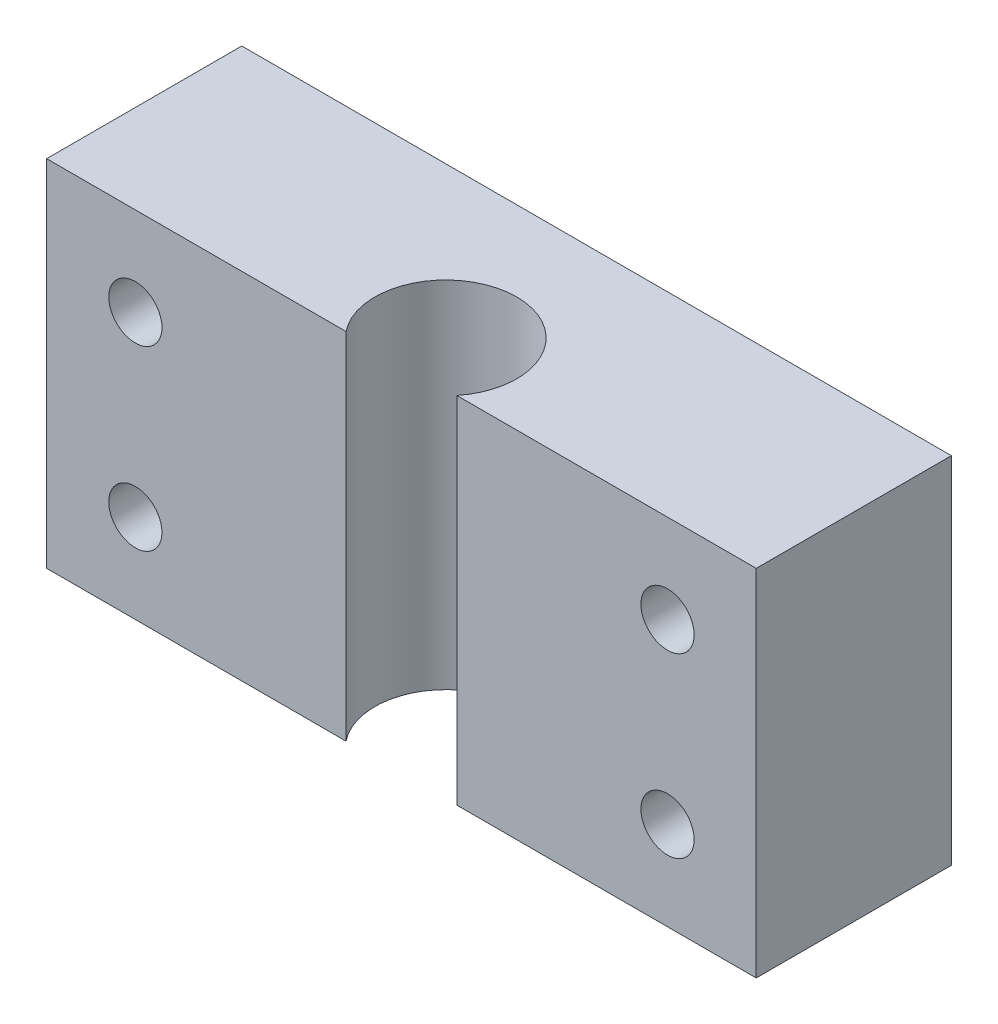
ISO-10303-21;
HEADER;
FILE_DESCRIPTION(('STEP AP214'),'2;1');
FILE_NAME('part.step','',(''),(''),'','','');
FILE_SCHEMA(('AUTOMOTIVE_DESIGN { 1 0 10303 214 1 1 1 1 }'));
ENDSEC;
DATA;
#1=APPLICATION_CONTEXT('core data for automotive mechanical design processes');
#2=APPLICATION_PROTOCOL_DEFINITION('international standard','automotive_design',2000,#1);
#3=PRODUCT_CONTEXT('',#1,'mechanical');
#4=PRODUCT('Part','Part','',(#3));
#5=PRODUCT_RELATED_PRODUCT_CATEGORY('part','',(#4));
#6=PRODUCT_DEFINITION_FORMATION('','',#4);
#7=PRODUCT_DEFINITION_CONTEXT('part definition',#1,'design');
#8=PRODUCT_DEFINITION('design','',#6,#7);
#9=PRODUCT_DEFINITION_SHAPE('','',#8);
#10=(LENGTH_UNIT() NAMED_UNIT(*) SI_UNIT(.MILLI.,.METRE.));
#11=(NAMED_UNIT(*) PLANE_ANGLE_UNIT() SI_UNIT($,.RADIAN.));
#12=(NAMED_UNIT(*) SI_UNIT($,.STERADIAN.) SOLID_ANGLE_UNIT());
#13=UNCERTAINTY_MEASURE_WITH_UNIT(LENGTH_MEASURE(1.E-05),#10,'distance_accuracy_value','');
#14=(GEOMETRIC_REPRESENTATION_CONTEXT(3) GLOBAL_UNCERTAINTY_ASSIGNED_CONTEXT((#13)) GLOBAL_UNIT_ASSIGNED_CONTEXT((#10,
#11,#12)) REPRESENTATION_CONTEXT('',''));
#15=CARTESIAN_POINT('',(0.,0.,0.));
#16=DIRECTION('',(0.,0.,1.));
#17=DIRECTION('',(1.,0.,0.));
#18=AXIS2_PLACEMENT_3D('',#15,#16,#17);
#19=CARTESIAN_POINT('',(0.,0.,22.));
#20=DIRECTION('',(0.,0.,1.));
#21=DIRECTION('',(1.,0.,0.));
#22=AXIS2_PLACEMENT_3D('',#19,#20,#21);
#23=PLANE('',#22);
#24=CARTESIAN_POINT('',(-30.0000000000006,-9.99999999999544,22.));
#25=DIRECTION('',(0.,0.,1.));
#26=DIRECTION('',(-1.,0.,0.));
#27=AXIS2_PLACEMENT_3D('',#24,#25,#26);
#28=CIRCLE('',#27,2.99999999999999);
#29=CARTESIAN_POINT('',(-33.0000000000006,-9.99999999999544,22.));
#30=VERTEX_POINT('',#29);
#31=EDGE_CURVE('E158',#30,#30,#28,.T.);
#32=ORIENTED_EDGE('',*,*,#31,.F.);
#33=EDGE_LOOP('',(#32));
#34=FACE_BOUND('',#33,.T.);
#35=CARTESIAN_POINT('',(-30.0000000000006,9.99999999999545,22.));
#36=DIRECTION('',(0.,0.,1.));
#37=DIRECTION('',(1.,0.,0.));
#38=AXIS2_PLACEMENT_3D('',#35,#36,#37);
#39=CIRCLE('',#38,3.);
#40=CARTESIAN_POINT('',(-27.0000000000006,9.99999999999545,22.));
#41=VERTEX_POINT('',#40);
#42=EDGE_CURVE('E140',#41,#41,#39,.T.);
#43=ORIENTED_EDGE('',*,*,#42,.F.);
#44=EDGE_LOOP('',(#43));
#45=FACE_BOUND('',#44,.T.);
#46=DIRECTION('',(0.,-1.,0.));
#47=VECTOR('',#46,1.);
#48=CARTESIAN_POINT('',(-6.2449979983984,20.,22.));
#49=LINE('',#48,#47);
#50=CARTESIAN_POINT('',(-6.2449979983984,20.,22.));
#51=VERTEX_POINT('',#50);
#52=CARTESIAN_POINT('',(-6.2449979983984,-20.,22.));
#53=VERTEX_POINT('',#52);
#54=EDGE_CURVE('E11',#51,#53,#49,.T.);
#55=ORIENTED_EDGE('',*,*,#54,.F.);
#56=DIRECTION('',(-1.,0.,0.));
#57=VECTOR('',#56,1.);
#58=CARTESIAN_POINT('',(-40.,20.,22.));
#59=LINE('',#58,#57);
#60=CARTESIAN_POINT('',(-40.,20.,22.));
#61=VERTEX_POINT('',#60);
#62=EDGE_CURVE('E133',#51,#61,#59,.T.);
#63=ORIENTED_EDGE('',*,*,#62,.T.);
#64=DIRECTION('',(0.,-1.,0.));
#65=VECTOR('',#64,1.);
#66=CARTESIAN_POINT('',(-40.,20.,22.));
#67=LINE('',#66,#65);
#68=CARTESIAN_POINT('',(-40.,-20.,22.));
#69=VERTEX_POINT('',#68);
#70=EDGE_CURVE('E108',#61,#69,#67,.T.);
#71=ORIENTED_EDGE('',*,*,#70,.T.);
#72=DIRECTION('',(1.,0.,0.));
#73=VECTOR('',#72,1.);
#74=CARTESIAN_POINT('',(-40.,-20.,22.));
#75=LINE('',#74,#73);
#76=EDGE_CURVE('E104',#69,#53,#75,.T.);
#77=ORIENTED_EDGE('',*,*,#76,.T.);
#78=EDGE_LOOP('',(#55,#63,#71,#77));
#79=FACE_BOUND('',#78,.T.);
#80=ADVANCED_FACE('F36',(#34,#45,#79),#23,.T.);
#81=CARTESIAN_POINT('',(40.,20.,22.));
#82=DIRECTION('',(-1.,0.,0.));
#83=DIRECTION('',(0.,0.,1.));
#84=AXIS2_PLACEMENT_3D('',#81,#82,#83);
#85=PLANE('',#84);
#86=DIRECTION('',(0.,1.,0.));
#87=VECTOR('',#86,1.);
#88=CARTESIAN_POINT('',(40.,20.,0.));
#89=LINE('',#88,#87);
#90=CARTESIAN_POINT('',(40.,-20.,0.));
#91=VERTEX_POINT('',#90);
#92=CARTESIAN_POINT('',(40.,20.,0.));
#93=VERTEX_POINT('',#92);
#94=EDGE_CURVE('E117',#91,#93,#89,.T.);
#95=ORIENTED_EDGE('',*,*,#94,.T.);
#96=DIRECTION('',(0.,0.,-1.));
#97=VECTOR('',#96,1.);
#98=CARTESIAN_POINT('',(40.,20.,22.));
#99=LINE('',#98,#97);
#100=CARTESIAN_POINT('',(40.,20.,22.));
#101=VERTEX_POINT('',#100);
#102=EDGE_CURVE('E130',#101,#93,#99,.T.);
#103=ORIENTED_EDGE('',*,*,#102,.F.);
#104=DIRECTION('',(0.,1.,0.));
#105=VECTOR('',#104,1.);
#106=CARTESIAN_POINT('',(40.,20.,22.));
#107=LINE('',#106,#105);
#108=CARTESIAN_POINT('',(40.,-20.,22.));
#109=VERTEX_POINT('',#108);
#110=EDGE_CURVE('E124',#109,#101,#107,.T.);
#111=ORIENTED_EDGE('',*,*,#110,.F.);
#112=DIRECTION('',(0.,0.,-1.));
#113=VECTOR('',#112,1.);
#114=CARTESIAN_POINT('',(40.,-20.,22.));
#115=LINE('',#114,#113);
#116=EDGE_CURVE('E110',#109,#91,#115,.T.);
#117=ORIENTED_EDGE('',*,*,#116,.T.);
#118=EDGE_LOOP('',(#95,#103,#111,#117));
#119=FACE_BOUND('',#118,.T.);
#120=ADVANCED_FACE('F38',(#119),#85,.F.);
#121=CARTESIAN_POINT('',(-40.,20.,22.));
#122=DIRECTION('',(0.,-1.,0.));
#123=DIRECTION('',(0.,0.,-1.));
#124=AXIS2_PLACEMENT_3D('',#121,#122,#123);
#125=PLANE('',#124);
#126=ORIENTED_EDGE('',*,*,#62,.F.);
#127=CARTESIAN_POINT('',(0.,20.,17.));
#128=DIRECTION('',(0.,-1.,0.));
#129=DIRECTION('',(0.,0.,-1.));
#130=AXIS2_PLACEMENT_3D('',#127,#128,#129);
#131=CIRCLE('',#130,8.);
#132=CARTESIAN_POINT('',(6.2449979983984,20.,22.));
#133=VERTEX_POINT('',#132);
#134=EDGE_CURVE('E98',#51,#133,#131,.T.);
#135=ORIENTED_EDGE('',*,*,#134,.T.);
#136=EDGE_CURVE('E88',#101,#133,#59,.T.);
#137=ORIENTED_EDGE('',*,*,#136,.F.);
#138=ORIENTED_EDGE('',*,*,#102,.T.);
#139=DIRECTION('',(-1.,0.,0.));
#140=VECTOR('',#139,1.);
#141=CARTESIAN_POINT('',(-40.,20.,0.));
#142=LINE('',#141,#140);
#143=CARTESIAN_POINT('',(-40.,20.,0.));
#144=VERTEX_POINT('',#143);
#145=EDGE_CURVE('E120',#93,#144,#142,.T.);
#146=ORIENTED_EDGE('',*,*,#145,.T.);
#147=DIRECTION('',(0.,0.,-1.));
#148=VECTOR('',#147,1.);
#149=CARTESIAN_POINT('',(-40.,20.,22.));
#150=LINE('',#149,#148);
#151=EDGE_CURVE('E127',#61,#144,#150,.T.);
#152=ORIENTED_EDGE('',*,*,#151,.F.);
#153=EDGE_LOOP('',(#126,#135,#137,#138,#146,#152));
#154=FACE_BOUND('',#153,.T.);
#155=ADVANCED_FACE('F131',(#154),#125,.F.);
#156=CARTESIAN_POINT('',(-40.,20.,22.));
#157=DIRECTION('',(1.,0.,0.));
#158=DIRECTION('',(0.,1.,0.));
#159=AXIS2_PLACEMENT_3D('',#156,#157,#158);
#160=PLANE('',#159);
#161=DIRECTION('',(0.,-1.,0.));
#162=VECTOR('',#161,1.);
#163=CARTESIAN_POINT('',(-40.,20.,0.));
#164=LINE('',#163,#162);
#165=CARTESIAN_POINT('',(-40.,-20.,0.));
#166=VERTEX_POINT('',#165);
#167=EDGE_CURVE('E122',#144,#166,#164,.T.);
#168=ORIENTED_EDGE('',*,*,#167,.T.);
#169=DIRECTION('',(0.,0.,-1.));
#170=VECTOR('',#169,1.);
#171=CARTESIAN_POINT('',(-40.,-20.,22.));
#172=LINE('',#171,#170);
#173=EDGE_CURVE('E112',#69,#166,#172,.T.);
#174=ORIENTED_EDGE('',*,*,#173,.F.);
#175=ORIENTED_EDGE('',*,*,#70,.F.);
#176=ORIENTED_EDGE('',*,*,#151,.T.);
#177=EDGE_LOOP('',(#168,#174,#175,#176));
#178=FACE_BOUND('',#177,.T.);
#179=ADVANCED_FACE('F199',(#178),#160,.F.);
#180=CARTESIAN_POINT('',(-40.,-20.,22.));
#181=DIRECTION('',(0.,1.,0.));
#182=DIRECTION('',(0.,0.,1.));
#183=AXIS2_PLACEMENT_3D('',#180,#181,#182);
#184=PLANE('',#183);
#185=CARTESIAN_POINT('',(6.2449979983984,-20.,22.));
#186=VERTEX_POINT('',#185);
#187=EDGE_CURVE('E58',#186,#109,#75,.T.);
#188=ORIENTED_EDGE('',*,*,#187,.F.);
#189=CARTESIAN_POINT('',(0.,-20.,17.));
#190=DIRECTION('',(0.,-1.,0.));
#191=DIRECTION('',(0.,0.,-1.));
#192=AXIS2_PLACEMENT_3D('',#189,#190,#191);
#193=CIRCLE('',#192,8.);
#194=EDGE_CURVE('E50',#53,#186,#193,.T.);
#195=ORIENTED_EDGE('',*,*,#194,.F.);
#196=ORIENTED_EDGE('',*,*,#76,.F.);
#197=ORIENTED_EDGE('',*,*,#173,.T.);
#198=DIRECTION('',(1.,0.,0.));
#199=VECTOR('',#198,1.);
#200=CARTESIAN_POINT('',(-40.,-20.,0.));
#201=LINE('',#200,#199);
#202=EDGE_CURVE('E80',#166,#91,#201,.T.);
#203=ORIENTED_EDGE('',*,*,#202,.T.);
#204=ORIENTED_EDGE('',*,*,#116,.F.);
#205=EDGE_LOOP('',(#188,#195,#196,#197,#203,#204));
#206=FACE_BOUND('',#205,.T.);
#207=ADVANCED_FACE('F103',(#206),#184,.F.);
#208=CARTESIAN_POINT('',(30.0000000000006,9.99999999999545,22.));
#209=DIRECTION('',(0.,0.,1.));
#210=DIRECTION('',(-1.,0.,0.));
#211=AXIS2_PLACEMENT_3D('',#208,#209,#210);
#212=CIRCLE('',#211,3.);
#213=CARTESIAN_POINT('',(27.0000000000006,9.99999999999545,22.));
#214=VERTEX_POINT('',#213);
#215=EDGE_CURVE('E146',#214,#214,#212,.T.);
#216=ORIENTED_EDGE('',*,*,#215,.F.);
#217=EDGE_LOOP('',(#216));
#218=FACE_BOUND('',#217,.T.);
#219=CARTESIAN_POINT('',(30.0000000000006,-9.99999999999544,22.));
#220=DIRECTION('',(0.,0.,1.));
#221=DIRECTION('',(1.,0.,0.));
#222=AXIS2_PLACEMENT_3D('',#219,#220,#221);
#223=CIRCLE('',#222,2.99999999999999);
#224=CARTESIAN_POINT('',(33.0000000000006,-9.99999999999544,22.));
#225=VERTEX_POINT('',#224);
#226=EDGE_CURVE('E152',#225,#225,#223,.T.);
#227=ORIENTED_EDGE('',*,*,#226,.F.);
#228=EDGE_LOOP('',(#227));
#229=FACE_BOUND('',#228,.T.);
#230=DIRECTION('',(0.,-1.,0.));
#231=VECTOR('',#230,1.);
#232=CARTESIAN_POINT('',(6.2449979983984,20.,22.));
#233=LINE('',#232,#231);
#234=EDGE_CURVE('E44',#186,#133,#233,.F.);
#235=ORIENTED_EDGE('',*,*,#234,.F.);
#236=ORIENTED_EDGE('',*,*,#187,.T.);
#237=ORIENTED_EDGE('',*,*,#110,.T.);
#238=ORIENTED_EDGE('',*,*,#136,.T.);
#239=EDGE_LOOP('',(#235,#236,#237,#238));
#240=FACE_BOUND('',#239,.T.);
#241=ADVANCED_FACE('F135',(#218,#229,#240),#23,.T.);
#242=CARTESIAN_POINT('',(0.,0.,0.));
#243=DIRECTION('',(0.,0.,1.));
#244=DIRECTION('',(1.,0.,0.));
#245=AXIS2_PLACEMENT_3D('',#242,#243,#244);
#246=PLANE('',#245);
#247=CARTESIAN_POINT('',(30.0000000000006,9.99999999999545,0.));
#248=DIRECTION('',(0.,0.,1.));
#249=DIRECTION('',(-1.,0.,0.));
#250=AXIS2_PLACEMENT_3D('',#247,#248,#249);
#251=CIRCLE('',#250,3.);
#252=CARTESIAN_POINT('',(27.0000000000006,9.99999999999545,0.));
#253=VERTEX_POINT('',#252);
#254=EDGE_CURVE('E149',#253,#253,#251,.T.);
#255=ORIENTED_EDGE('',*,*,#254,.T.);
#256=EDGE_LOOP('',(#255));
#257=FACE_BOUND('',#256,.T.);
#258=CARTESIAN_POINT('',(30.0000000000006,-9.99999999999544,0.));
#259=DIRECTION('',(0.,0.,1.));
#260=DIRECTION('',(1.,0.,0.));
#261=AXIS2_PLACEMENT_3D('',#258,#259,#260);
#262=CIRCLE('',#261,2.99999999999999);
#263=CARTESIAN_POINT('',(33.0000000000006,-9.99999999999544,0.));
#264=VERTEX_POINT('',#263);
#265=EDGE_CURVE('E155',#264,#264,#262,.T.);
#266=ORIENTED_EDGE('',*,*,#265,.T.);
#267=EDGE_LOOP('',(#266));
#268=FACE_BOUND('',#267,.T.);
#269=CARTESIAN_POINT('',(-30.0000000000006,-9.99999999999544,0.));
#270=DIRECTION('',(0.,0.,1.));
#271=DIRECTION('',(-1.,0.,0.));
#272=AXIS2_PLACEMENT_3D('',#269,#270,#271);
#273=CIRCLE('',#272,2.99999999999999);
#274=CARTESIAN_POINT('',(-33.0000000000006,-9.99999999999544,0.));
#275=VERTEX_POINT('',#274);
#276=EDGE_CURVE('E143',#275,#275,#273,.T.);
#277=ORIENTED_EDGE('',*,*,#276,.T.);
#278=EDGE_LOOP('',(#277));
#279=FACE_BOUND('',#278,.T.);
#280=CARTESIAN_POINT('',(-30.0000000000006,9.99999999999545,0.));
#281=DIRECTION('',(0.,0.,1.));
#282=DIRECTION('',(1.,0.,0.));
#283=AXIS2_PLACEMENT_3D('',#280,#281,#282);
#284=CIRCLE('',#283,3.);
#285=CARTESIAN_POINT('',(-27.0000000000006,9.99999999999545,0.));
#286=VERTEX_POINT('',#285);
#287=EDGE_CURVE('E105',#286,#286,#284,.T.);
#288=ORIENTED_EDGE('',*,*,#287,.T.);
#289=EDGE_LOOP('',(#288));
#290=FACE_BOUND('',#289,.T.);
#291=ORIENTED_EDGE('',*,*,#94,.F.);
#292=ORIENTED_EDGE('',*,*,#202,.F.);
#293=ORIENTED_EDGE('',*,*,#167,.F.);
#294=ORIENTED_EDGE('',*,*,#145,.F.);
#295=EDGE_LOOP('',(#291,#292,#293,#294));
#296=FACE_BOUND('',#295,.T.);
#297=ADVANCED_FACE('F164',(#257,#268,#279,#290,#296),#246,.F.);
#298=CARTESIAN_POINT('',(0.,20.,17.));
#299=DIRECTION('',(0.,-1.,0.));
#300=DIRECTION('',(0.,0.,-1.));
#301=AXIS2_PLACEMENT_3D('',#298,#299,#300);
#302=CYLINDRICAL_SURFACE('',#301,8.);
#303=ORIENTED_EDGE('',*,*,#54,.T.);
#304=ORIENTED_EDGE('',*,*,#194,.T.);
#305=ORIENTED_EDGE('',*,*,#234,.T.);
#306=ORIENTED_EDGE('',*,*,#134,.F.);
#307=EDGE_LOOP('',(#303,#304,#305,#306));
#308=FACE_BOUND('',#307,.T.);
#309=ADVANCED_FACE('F97',(#308),#302,.F.);
#310=CARTESIAN_POINT('',(-30.0000000000006,9.99999999999545,0.));
#311=DIRECTION('',(0.,0.,1.));
#312=DIRECTION('',(1.,0.,0.));
#313=AXIS2_PLACEMENT_3D('',#310,#311,#312);
#314=CYLINDRICAL_SURFACE('',#313,3.);
#315=ORIENTED_EDGE('',*,*,#287,.F.);
#316=EDGE_LOOP('',(#315));
#317=FACE_BOUND('',#316,.T.);
#318=ORIENTED_EDGE('',*,*,#42,.T.);
#319=EDGE_LOOP('',(#318));
#320=FACE_BOUND('',#319,.T.);
#321=ADVANCED_FACE('F171',(#317,#320),#314,.F.);
#322=CARTESIAN_POINT('',(-30.0000000000006,-9.99999999999544,0.));
#323=DIRECTION('',(0.,0.,1.));
#324=DIRECTION('',(1.,0.,0.));
#325=AXIS2_PLACEMENT_3D('',#322,#323,#324);
#326=CYLINDRICAL_SURFACE('',#325,2.99999999999999);
#327=ORIENTED_EDGE('',*,*,#276,.F.);
#328=EDGE_LOOP('',(#327));
#329=FACE_BOUND('',#328,.T.);
#330=ORIENTED_EDGE('',*,*,#31,.T.);
#331=EDGE_LOOP('',(#330));
#332=FACE_BOUND('',#331,.T.);
#333=ADVANCED_FACE('F167',(#329,#332),#326,.F.);
#334=CARTESIAN_POINT('',(30.0000000000006,-9.99999999999544,0.));
#335=DIRECTION('',(0.,0.,1.));
#336=DIRECTION('',(1.,0.,0.));
#337=AXIS2_PLACEMENT_3D('',#334,#335,#336);
#338=CYLINDRICAL_SURFACE('',#337,2.99999999999999);
#339=ORIENTED_EDGE('',*,*,#265,.F.);
#340=EDGE_LOOP('',(#339));
#341=FACE_BOUND('',#340,.T.);
#342=ORIENTED_EDGE('',*,*,#226,.T.);
#343=EDGE_LOOP('',(#342));
#344=FACE_BOUND('',#343,.T.);
#345=ADVANCED_FACE('F170',(#341,#344),#338,.F.);
#346=CARTESIAN_POINT('',(30.0000000000006,9.99999999999545,0.));
#347=DIRECTION('',(0.,0.,1.));
#348=DIRECTION('',(1.,0.,0.));
#349=AXIS2_PLACEMENT_3D('',#346,#347,#348);
#350=CYLINDRICAL_SURFACE('',#349,3.);
#351=ORIENTED_EDGE('',*,*,#254,.F.);
#352=EDGE_LOOP('',(#351));
#353=FACE_BOUND('',#352,.T.);
#354=ORIENTED_EDGE('',*,*,#215,.T.);
#355=EDGE_LOOP('',(#354));
#356=FACE_BOUND('',#355,.T.);
#357=ADVANCED_FACE('F189',(#353,#356),#350,.F.);
#358=CLOSED_SHELL('',(#80,#120,#155,#179,#207,#241,#297,#309,#321,#333,#345,#357));
#359=MANIFOLD_SOLID_BREP('B2',#358);
#360=ADVANCED_BREP_SHAPE_REPRESENTATION('',(#18,#359),#14);
#361=SHAPE_DEFINITION_REPRESENTATION(#9,#360);
ENDSEC;
END-ISO-10303-21;
